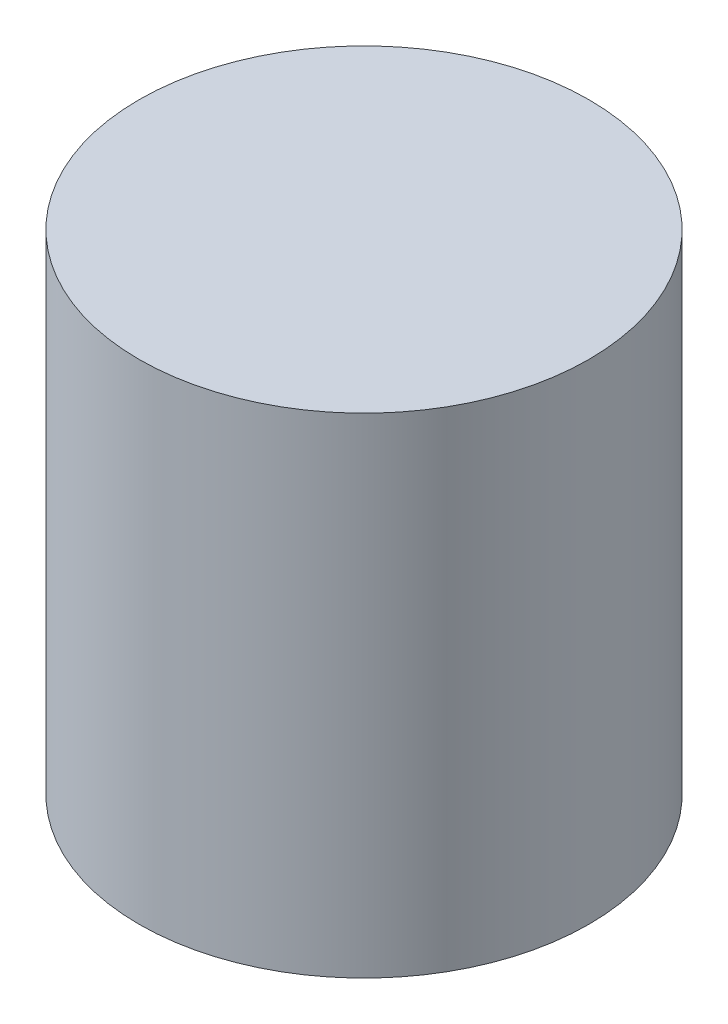
ISO-10303-21;
HEADER;
FILE_DESCRIPTION(('STEP AP214'),'2;1');
FILE_NAME('part.step','',(''),(''),'','','');
FILE_SCHEMA(('AUTOMOTIVE_DESIGN { 1 0 10303 214 1 1 1 1 }'));
ENDSEC;
DATA;
#1=APPLICATION_CONTEXT('core data for automotive mechanical design processes');
#2=APPLICATION_PROTOCOL_DEFINITION('international standard','automotive_design',2000,#1);
#3=PRODUCT_CONTEXT('',#1,'mechanical');
#4=PRODUCT('Part','Part','',(#3));
#5=PRODUCT_RELATED_PRODUCT_CATEGORY('part','',(#4));
#6=PRODUCT_DEFINITION_FORMATION('','',#4);
#7=PRODUCT_DEFINITION_CONTEXT('part definition',#1,'design');
#8=PRODUCT_DEFINITION('design','',#6,#7);
#9=PRODUCT_DEFINITION_SHAPE('','',#8);
#10=(LENGTH_UNIT() NAMED_UNIT(*) SI_UNIT(.MILLI.,.METRE.));
#11=(NAMED_UNIT(*) PLANE_ANGLE_UNIT() SI_UNIT($,.RADIAN.));
#12=(NAMED_UNIT(*) SI_UNIT($,.STERADIAN.) SOLID_ANGLE_UNIT());
#13=UNCERTAINTY_MEASURE_WITH_UNIT(LENGTH_MEASURE(1.E-05),#10,'distance_accuracy_value','');
#14=(GEOMETRIC_REPRESENTATION_CONTEXT(3) GLOBAL_UNCERTAINTY_ASSIGNED_CONTEXT((#13)) GLOBAL_UNIT_ASSIGNED_CONTEXT((#10,
#11,#12)) REPRESENTATION_CONTEXT('',''));
#15=CARTESIAN_POINT('',(0.,0.,0.));
#16=DIRECTION('',(0.,0.,1.));
#17=DIRECTION('',(1.,0.,0.));
#18=AXIS2_PLACEMENT_3D('',#15,#16,#17);
#19=CARTESIAN_POINT('',(0.,4.35,0.));
#20=DIRECTION('',(0.,-1.,0.));
#21=DIRECTION('',(0.,0.,-1.));
#22=AXIS2_PLACEMENT_3D('',#19,#20,#21);
#23=CYLINDRICAL_SURFACE('',#22,2.);
#24=CARTESIAN_POINT('',(0.,4.35,0.));
#25=DIRECTION('',(0.,1.,0.));
#26=DIRECTION('',(0.,0.,1.));
#27=AXIS2_PLACEMENT_3D('',#24,#25,#26);
#28=CIRCLE('',#27,2.);
#29=CARTESIAN_POINT('',(0.,4.35,2.));
#30=VERTEX_POINT('',#29);
#31=EDGE_CURVE('E10',#30,#30,#28,.T.);
#32=ORIENTED_EDGE('',*,*,#31,.F.);
#33=EDGE_LOOP('',(#32));
#34=FACE_BOUND('',#33,.T.);
#35=CARTESIAN_POINT('',(0.,0.,0.));
#36=DIRECTION('',(0.,1.,0.));
#37=DIRECTION('',(0.,0.,1.));
#38=AXIS2_PLACEMENT_3D('',#35,#36,#37);
#39=CIRCLE('',#38,2.);
#40=CARTESIAN_POINT('',(0.,0.,2.));
#41=VERTEX_POINT('',#40);
#42=EDGE_CURVE('E40',#41,#41,#39,.T.);
#43=ORIENTED_EDGE('',*,*,#42,.T.);
#44=EDGE_LOOP('',(#43));
#45=FACE_BOUND('',#44,.T.);
#46=ADVANCED_FACE('F37',(#34,#45),#23,.T.);
#47=CARTESIAN_POINT('',(0.,4.35,0.));
#48=DIRECTION('',(0.,1.,0.));
#49=DIRECTION('',(0.,0.,1.));
#50=AXIS2_PLACEMENT_3D('',#47,#48,#49);
#51=PLANE('',#50);
#52=ORIENTED_EDGE('',*,*,#31,.T.);
#53=EDGE_LOOP('',(#52));
#54=FACE_BOUND('',#53,.T.);
#55=ADVANCED_FACE('F54',(#54),#51,.T.);
#56=CARTESIAN_POINT('',(0.,0.,0.));
#57=DIRECTION('',(0.,1.,0.));
#58=DIRECTION('',(0.,0.,1.));
#59=AXIS2_PLACEMENT_3D('',#56,#57,#58);
#60=PLANE('',#59);
#61=ORIENTED_EDGE('',*,*,#42,.F.);
#62=EDGE_LOOP('',(#61));
#63=FACE_BOUND('',#62,.T.);
#64=ADVANCED_FACE('F52',(#63),#60,.F.);
#65=CLOSED_SHELL('',(#46,#55,#64));
#66=MANIFOLD_SOLID_BREP('B2',#65);
#67=ADVANCED_BREP_SHAPE_REPRESENTATION('',(#18,#66),#14);
#68=SHAPE_DEFINITION_REPRESENTATION(#9,#67);
ENDSEC;
END-ISO-10303-21;
